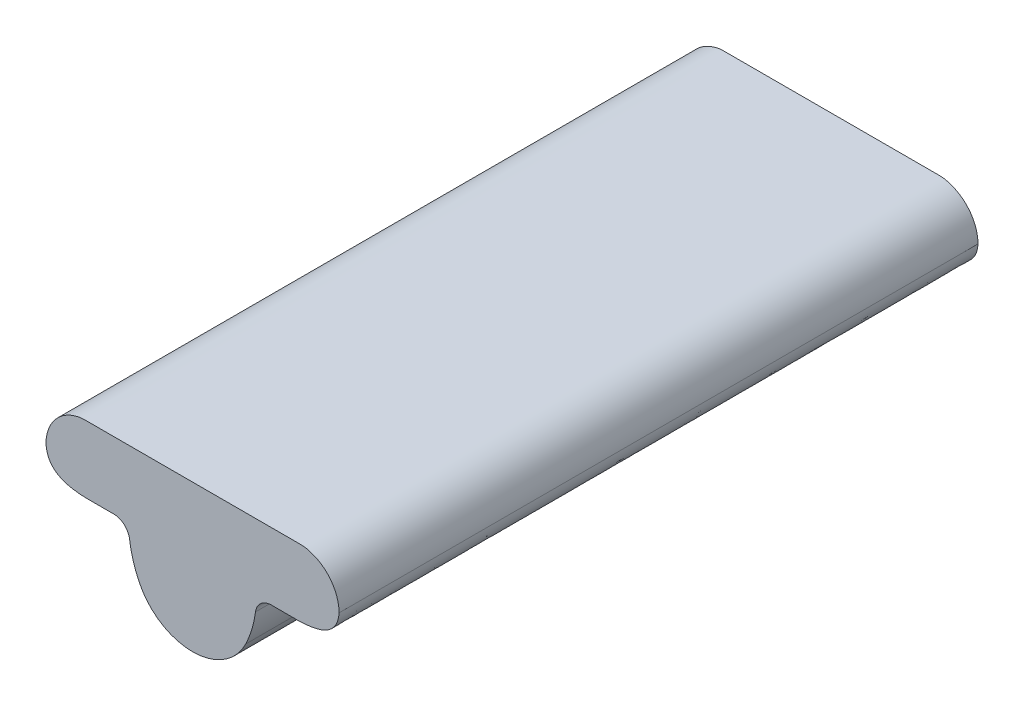
ISO-10303-21;
HEADER;
FILE_DESCRIPTION(('STEP AP214'),'2;1');
FILE_NAME('part.step','',(''),(''),'','','');
FILE_SCHEMA(('AUTOMOTIVE_DESIGN { 1 0 10303 214 1 1 1 1 }'));
ENDSEC;
DATA;
#1=APPLICATION_CONTEXT('core data for automotive mechanical design processes');
#2=APPLICATION_PROTOCOL_DEFINITION('international standard','automotive_design',2000,#1);
#3=PRODUCT_CONTEXT('',#1,'mechanical');
#4=PRODUCT('Part','Part','',(#3));
#5=PRODUCT_RELATED_PRODUCT_CATEGORY('part','',(#4));
#6=PRODUCT_DEFINITION_FORMATION('','',#4);
#7=PRODUCT_DEFINITION_CONTEXT('part definition',#1,'design');
#8=PRODUCT_DEFINITION('design','',#6,#7);
#9=PRODUCT_DEFINITION_SHAPE('','',#8);
#10=(LENGTH_UNIT() NAMED_UNIT(*) SI_UNIT(.MILLI.,.METRE.));
#11=(NAMED_UNIT(*) PLANE_ANGLE_UNIT() SI_UNIT($,.RADIAN.));
#12=(NAMED_UNIT(*) SI_UNIT($,.STERADIAN.) SOLID_ANGLE_UNIT());
#13=UNCERTAINTY_MEASURE_WITH_UNIT(LENGTH_MEASURE(1.E-05),#10,'distance_accuracy_value','');
#14=(GEOMETRIC_REPRESENTATION_CONTEXT(3) GLOBAL_UNCERTAINTY_ASSIGNED_CONTEXT((#13)) GLOBAL_UNIT_ASSIGNED_CONTEXT((#10,
#11,#12)) REPRESENTATION_CONTEXT('',''));
#15=CARTESIAN_POINT('',(0.,0.,0.));
#16=DIRECTION('',(0.,0.,1.));
#17=DIRECTION('',(1.,0.,0.));
#18=AXIS2_PLACEMENT_3D('',#15,#16,#17);
#19=CARTESIAN_POINT('',(-1.376,0.,6.));
#20=CARTESIAN_POINT('',(-1.376,0.156890105253039,6.));
#21=CARTESIAN_POINT('',(-1.2888365276661,0.28733946024189,6.));
#22=CARTESIAN_POINT('',(-1.14388897056927,0.347378704224244,6.));
#23=CARTESIAN_POINT('',(-1.12882892095402,0.353616781024894,6.));
#24=CARTESIAN_POINT('',(-1.09789749611564,0.364134221340183,6.));
#25=CARTESIAN_POINT('',(-1.04890264071871,0.376,6.));
#26=CARTESIAN_POINT('',(-1.01630088023957,0.376,6.));
#27=CARTESIAN_POINT('',(-1.,0.376,6.));
#28=CARTESIAN_POINT('',(-0.983699119760431,0.376,6.));
#29=CARTESIAN_POINT('',(-0.951097359281291,0.376,6.));
#30=CARTESIAN_POINT('',(-0.902194718562581,0.376,6.));
#31=CARTESIAN_POINT('',(-0.869592958083441,0.376,6.));
#32=CARTESIAN_POINT('',(-0.853292077843871,0.376,6.));
#33=CARTESIAN_POINT('',(-0.284430692614624,0.376,6.));
#34=CARTESIAN_POINT('',(0.284430692614624,0.376,6.));
#35=CARTESIAN_POINT('',(0.853292077843872,0.376,6.));
#36=CARTESIAN_POINT('',(0.869592958083442,0.376,6.));
#37=CARTESIAN_POINT('',(0.902194718562581,0.376,6.));
#38=CARTESIAN_POINT('',(0.951097359281291,0.376,6.));
#39=CARTESIAN_POINT('',(0.983699119760431,0.376,6.));
#40=CARTESIAN_POINT('',(1.,0.376,6.));
#41=CARTESIAN_POINT('',(1.01630088023957,0.376,6.));
#42=CARTESIAN_POINT('',(1.04890264071871,0.376,6.));
#43=CARTESIAN_POINT('',(1.09789749611564,0.364134221340183,6.));
#44=CARTESIAN_POINT('',(1.12882892095402,0.353616781024895,6.));
#45=CARTESIAN_POINT('',(1.14388897056927,0.347378704224244,6.));
#46=CARTESIAN_POINT('',(1.2888365276661,0.28733946024189,6.));
#47=CARTESIAN_POINT('',(1.376,0.15689010525304,6.));
#48=CARTESIAN_POINT('',(1.376,0.,6.));
#49=(BOUNDED_CURVE() B_SPLINE_CURVE(3,(#19,#20,#21,#22,#23,#24,#25,#26,#27,#28,#29,#30,#31,#32,
#33,#34,#35,#36,#37,#38,#39,#40,#41,#42,#43,#44,#45,#46,#47,#48),.UNSPECIFIED.,.F.,
.F.) B_SPLINE_CURVE_WITH_KNOTS((4,3,1,1,3,1,1,3,3,1,1,3,1,1,3,4),(0.,0.133521791783524,
0.149150664490664,0.164779537197804,0.180408409904944,0.196037282612083,0.211666155319223,
0.227295028026362,0.772704971973638,0.788333844680778,0.803962717387918,0.819591590095057,
0.835220462802197,0.850849335509337,0.866478208216477,1.),
.UNSPECIFIED.) CURVE() GEOMETRIC_REPRESENTATION_ITEM() RATIONAL_B_SPLINE_CURVE((1.,
0.887646408201697,0.887646408201697,1.,1.,1.,1.,1.,1.,1.,1.,1.,1.,1.,1.,1.,1.,1.,1.,1.,1.,1.,1.,
1.,1.,1.,1.,0.887646408201697,0.887646408201697,1.)) REPRESENTATION_ITEM(''));
#50=DIRECTION('',(0.,0.,-1.));
#51=VECTOR('',#50,1.);
#52=SURFACE_OF_LINEAR_EXTRUSION('',#49,#51);
#53=CARTESIAN_POINT('',(-1.376,0.,0.));
#54=CARTESIAN_POINT('',(-1.376,0.156890105253039,0.));
#55=CARTESIAN_POINT('',(-1.2888365276661,0.28733946024189,0.));
#56=CARTESIAN_POINT('',(-1.14388897056927,0.347378704224244,0.));
#57=CARTESIAN_POINT('',(-1.12882892095402,0.353616781024894,0.));
#58=CARTESIAN_POINT('',(-1.09789749611564,0.364134221340183,0.));
#59=CARTESIAN_POINT('',(-1.04890264071871,0.376,0.));
#60=CARTESIAN_POINT('',(-1.01630088023957,0.376,0.));
#61=CARTESIAN_POINT('',(-1.,0.376,0.));
#62=CARTESIAN_POINT('',(-0.983699119760431,0.376,0.));
#63=CARTESIAN_POINT('',(-0.951097359281291,0.376,0.));
#64=CARTESIAN_POINT('',(-0.902194718562581,0.376,0.));
#65=CARTESIAN_POINT('',(-0.869592958083441,0.376,0.));
#66=CARTESIAN_POINT('',(-0.853292077843871,0.376,0.));
#67=CARTESIAN_POINT('',(-0.284430692614624,0.376,0.));
#68=CARTESIAN_POINT('',(0.284430692614624,0.376,0.));
#69=CARTESIAN_POINT('',(0.853292077843872,0.376,0.));
#70=CARTESIAN_POINT('',(0.869592958083442,0.376,0.));
#71=CARTESIAN_POINT('',(0.902194718562581,0.376,0.));
#72=CARTESIAN_POINT('',(0.951097359281291,0.376,0.));
#73=CARTESIAN_POINT('',(0.983699119760431,0.376,0.));
#74=CARTESIAN_POINT('',(1.,0.376,0.));
#75=CARTESIAN_POINT('',(1.01630088023957,0.376,0.));
#76=CARTESIAN_POINT('',(1.04890264071871,0.376,0.));
#77=CARTESIAN_POINT('',(1.09789749611564,0.364134221340183,0.));
#78=CARTESIAN_POINT('',(1.12882892095402,0.353616781024895,0.));
#79=CARTESIAN_POINT('',(1.14388897056927,0.347378704224244,0.));
#80=CARTESIAN_POINT('',(1.2888365276661,0.28733946024189,0.));
#81=CARTESIAN_POINT('',(1.376,0.15689010525304,0.));
#82=CARTESIAN_POINT('',(1.376,0.,0.));
#83=(BOUNDED_CURVE() B_SPLINE_CURVE(3,(#53,#54,#55,#56,#57,#58,#59,#60,#61,#62,#63,#64,#65,#66,
#67,#68,#69,#70,#71,#72,#73,#74,#75,#76,#77,#78,#79,#80,#81,#82),.UNSPECIFIED.,.F.,
.F.) B_SPLINE_CURVE_WITH_KNOTS((4,3,1,1,3,1,1,3,3,1,1,3,1,1,3,4),(0.,0.133521791783524,
0.149150664490664,0.164779537197804,0.180408409904944,0.196037282612083,0.211666155319223,
0.227295028026362,0.772704971973638,0.788333844680778,0.803962717387918,0.819591590095057,
0.835220462802197,0.850849335509337,0.866478208216477,1.),
.UNSPECIFIED.) CURVE() GEOMETRIC_REPRESENTATION_ITEM() RATIONAL_B_SPLINE_CURVE((1.,
0.887646408201697,0.887646408201697,1.,1.,1.,1.,1.,1.,1.,1.,1.,1.,1.,1.,1.,1.,1.,1.,1.,1.,1.,1.,
1.,1.,1.,1.,0.887646408201697,0.887646408201697,1.)) REPRESENTATION_ITEM(''));
#84=CARTESIAN_POINT('',(-1.376,0.,0.));
#85=VERTEX_POINT('',#84);
#86=CARTESIAN_POINT('',(1.376,0.,0.));
#87=VERTEX_POINT('',#86);
#88=EDGE_CURVE('E148',#85,#87,#83,.T.);
#89=ORIENTED_EDGE('',*,*,#88,.F.);
#90=DIRECTION('',(0.,0.,-1.));
#91=VECTOR('',#90,1.);
#92=CARTESIAN_POINT('',(-1.376,0.,6.));
#93=LINE('',#92,#91);
#94=CARTESIAN_POINT('',(-1.376,0.,6.));
#95=VERTEX_POINT('',#94);
#96=EDGE_CURVE('E11',#95,#85,#93,.T.);
#97=ORIENTED_EDGE('',*,*,#96,.F.);
#98=CARTESIAN_POINT('',(1.376,0.,6.));
#99=VERTEX_POINT('',#98);
#100=EDGE_CURVE('E194',#95,#99,#49,.T.);
#101=ORIENTED_EDGE('',*,*,#100,.T.);
#102=DIRECTION('',(0.,0.,-1.));
#103=VECTOR('',#102,1.);
#104=CARTESIAN_POINT('',(1.376,0.,6.));
#105=LINE('',#104,#103);
#106=EDGE_CURVE('E38',#99,#87,#105,.T.);
#107=ORIENTED_EDGE('',*,*,#106,.T.);
#108=EDGE_LOOP('',(#89,#97,#101,#107));
#109=FACE_BOUND('',#108,.T.);
#110=ADVANCED_FACE('F34',(#109),#52,.T.);
#111=CARTESIAN_POINT('',(-1.376,0.,6.));
#112=CARTESIAN_POINT('',(-1.36230221551758,-0.221622552450132,6.));
#113=CARTESIAN_POINT('',(-1.15141855491426,-0.248602833056371,6.));
#114=CARTESIAN_POINT('',(-1.,-0.254,6.));
#115=B_SPLINE_CURVE_WITH_KNOTS('',3,(#111,#112,#113,#114),.UNSPECIFIED.,.F.,.F.,(4,4),(0.,1.),.UNSPECIFIED.);
#116=DIRECTION('',(0.,0.,-1.));
#117=VECTOR('',#116,1.);
#118=SURFACE_OF_LINEAR_EXTRUSION('',#115,#117);
#119=CARTESIAN_POINT('',(-1.376,0.,0.));
#120=CARTESIAN_POINT('',(-1.36230221551758,-0.221622552450132,0.));
#121=CARTESIAN_POINT('',(-1.15141855491426,-0.248602833056371,0.));
#122=CARTESIAN_POINT('',(-1.,-0.254,0.));
#123=B_SPLINE_CURVE_WITH_KNOTS('',3,(#119,#120,#121,#122),.UNSPECIFIED.,.F.,.F.,(4,4),(0.,1.),.UNSPECIFIED.);
#124=CARTESIAN_POINT('',(-1.,-0.254,0.));
#125=VERTEX_POINT('',#124);
#126=EDGE_CURVE('E86',#85,#125,#123,.T.);
#127=ORIENTED_EDGE('',*,*,#126,.T.);
#128=DIRECTION('',(0.,0.,-1.));
#129=VECTOR('',#128,1.);
#130=CARTESIAN_POINT('',(-1.,-0.254,6.));
#131=LINE('',#130,#129);
#132=CARTESIAN_POINT('',(-1.,-0.254,6.));
#133=VERTEX_POINT('',#132);
#134=EDGE_CURVE('E44',#133,#125,#131,.T.);
#135=ORIENTED_EDGE('',*,*,#134,.F.);
#136=EDGE_CURVE('E123',#95,#133,#115,.T.);
#137=ORIENTED_EDGE('',*,*,#136,.F.);
#138=ORIENTED_EDGE('',*,*,#96,.T.);
#139=EDGE_LOOP('',(#127,#135,#137,#138));
#140=FACE_BOUND('',#139,.T.);
#141=ADVANCED_FACE('F156',(#140),#118,.F.);
#142=CARTESIAN_POINT('',(-1.,-0.254,6.));
#143=DIRECTION('',(0.,1.,0.));
#144=DIRECTION('',(-1.,0.,0.));
#145=AXIS2_PLACEMENT_3D('',#142,#143,#144);
#146=PLANE('',#145);
#147=DIRECTION('',(1.,0.,0.));
#148=VECTOR('',#147,1.);
#149=CARTESIAN_POINT('',(-1.,-0.254,0.));
#150=LINE('',#149,#148);
#151=CARTESIAN_POINT('',(-0.740175425099138,-0.254,0.));
#152=VERTEX_POINT('',#151);
#153=EDGE_CURVE('E130',#125,#152,#150,.T.);
#154=ORIENTED_EDGE('',*,*,#153,.T.);
#155=DIRECTION('',(0.,0.,-1.));
#156=VECTOR('',#155,1.);
#157=CARTESIAN_POINT('',(-0.740175425099138,-0.254,6.));
#158=LINE('',#157,#156);
#159=CARTESIAN_POINT('',(-0.740175425099138,-0.254,6.));
#160=VERTEX_POINT('',#159);
#161=EDGE_CURVE('E127',#160,#152,#158,.T.);
#162=ORIENTED_EDGE('',*,*,#161,.F.);
#163=DIRECTION('',(1.,0.,0.));
#164=VECTOR('',#163,1.);
#165=CARTESIAN_POINT('',(-1.,-0.254,6.));
#166=LINE('',#165,#164);
#167=EDGE_CURVE('E117',#133,#160,#166,.T.);
#168=ORIENTED_EDGE('',*,*,#167,.F.);
#169=ORIENTED_EDGE('',*,*,#134,.T.);
#170=EDGE_LOOP('',(#154,#162,#168,#169));
#171=FACE_BOUND('',#170,.T.);
#172=ADVANCED_FACE('F128',(#171),#146,.F.);
#173=CARTESIAN_POINT('',(-0.740175425099138,-0.404,6.));
#174=DIRECTION('',(0.,0.,-1.));
#175=DIRECTION('',(-1.,0.,0.));
#176=AXIS2_PLACEMENT_3D('',#173,#174,#175);
#177=CYLINDRICAL_SURFACE('',#176,0.15);
#178=CARTESIAN_POINT('',(-0.740175425099138,-0.404,0.));
#179=DIRECTION('',(0.,0.,1.));
#180=DIRECTION('',(1.,0.,0.));
#181=AXIS2_PLACEMENT_3D('',#178,#179,#180);
#182=CIRCLE('',#181,0.15);
#183=CARTESIAN_POINT('',(-0.591456891390555,-0.384434782608696,0.));
#184=VERTEX_POINT('',#183);
#185=EDGE_CURVE('E250',#184,#152,#182,.T.);
#186=ORIENTED_EDGE('',*,*,#185,.F.);
#187=DIRECTION('',(0.,0.,-1.));
#188=VECTOR('',#187,1.);
#189=CARTESIAN_POINT('',(-0.591456891390555,-0.384434782608696,6.));
#190=LINE('',#189,#188);
#191=CARTESIAN_POINT('',(-0.591456891390555,-0.384434782608696,6.));
#192=VERTEX_POINT('',#191);
#193=EDGE_CURVE('E134',#192,#184,#190,.T.);
#194=ORIENTED_EDGE('',*,*,#193,.F.);
#195=CARTESIAN_POINT('',(-0.740175425099138,-0.404,6.));
#196=DIRECTION('',(0.,0.,1.));
#197=DIRECTION('',(1.,0.,0.));
#198=AXIS2_PLACEMENT_3D('',#195,#196,#197);
#199=CIRCLE('',#198,0.15);
#200=EDGE_CURVE('E122',#192,#160,#199,.T.);
#201=ORIENTED_EDGE('',*,*,#200,.T.);
#202=ORIENTED_EDGE('',*,*,#161,.T.);
#203=EDGE_LOOP('',(#186,#194,#201,#202));
#204=FACE_BOUND('',#203,.T.);
#205=ADVANCED_FACE('F136',(#204),#177,.F.);
#206=CARTESIAN_POINT('',(0.4,-0.254,6.));
#207=DIRECTION('',(0.,0.,-1.));
#208=DIRECTION('',(-1.,0.,0.));
#209=AXIS2_PLACEMENT_3D('',#206,#207,#208);
#210=CYLINDRICAL_SURFACE('',#209,1.);
#211=CARTESIAN_POINT('',(0.4,-0.254,0.));
#212=DIRECTION('',(0.,0.,1.));
#213=DIRECTION('',(1.,0.,0.));
#214=AXIS2_PLACEMENT_3D('',#211,#212,#213);
#215=CIRCLE('',#214,1.);
#216=CARTESIAN_POINT('',(-0.498876404494382,-0.692202247191012,0.));
#217=VERTEX_POINT('',#216);
#218=EDGE_CURVE('E248',#184,#217,#215,.T.);
#219=ORIENTED_EDGE('',*,*,#218,.T.);
#220=DIRECTION('',(0.,0.,-1.));
#221=VECTOR('',#220,1.);
#222=CARTESIAN_POINT('',(-0.498876404494382,-0.692202247191012,6.));
#223=LINE('',#222,#221);
#224=CARTESIAN_POINT('',(-0.498876404494382,-0.692202247191012,6.));
#225=VERTEX_POINT('',#224);
#226=EDGE_CURVE('E218',#225,#217,#223,.T.);
#227=ORIENTED_EDGE('',*,*,#226,.F.);
#228=CARTESIAN_POINT('',(0.4,-0.254,6.));
#229=DIRECTION('',(0.,0.,1.));
#230=DIRECTION('',(1.,0.,0.));
#231=AXIS2_PLACEMENT_3D('',#228,#229,#230);
#232=CIRCLE('',#231,1.);
#233=EDGE_CURVE('E138',#192,#225,#232,.T.);
#234=ORIENTED_EDGE('',*,*,#233,.F.);
#235=ORIENTED_EDGE('',*,*,#193,.T.);
#236=EDGE_LOOP('',(#219,#227,#234,#235));
#237=FACE_BOUND('',#236,.T.);
#238=ADVANCED_FACE('F166',(#237),#210,.T.);
#239=CARTESIAN_POINT('',(0.,-0.449,6.));
#240=DIRECTION('',(0.,0.,-1.));
#241=DIRECTION('',(-1.,0.,0.));
#242=AXIS2_PLACEMENT_3D('',#239,#240,#241);
#243=CYLINDRICAL_SURFACE('',#242,0.555);
#244=CARTESIAN_POINT('',(0.,-0.449,0.));
#245=DIRECTION('',(0.,0.,1.));
#246=DIRECTION('',(1.,0.,0.));
#247=AXIS2_PLACEMENT_3D('',#244,#245,#246);
#248=CIRCLE('',#247,0.555);
#249=CARTESIAN_POINT('',(0.498876404494382,-0.692202247191012,0.));
#250=VERTEX_POINT('',#249);
#251=EDGE_CURVE('E215',#217,#250,#248,.T.);
#252=ORIENTED_EDGE('',*,*,#251,.T.);
#253=DIRECTION('',(0.,0.,-1.));
#254=VECTOR('',#253,1.);
#255=CARTESIAN_POINT('',(0.498876404494382,-0.692202247191012,6.));
#256=LINE('',#255,#254);
#257=CARTESIAN_POINT('',(0.498876404494382,-0.692202247191012,6.));
#258=VERTEX_POINT('',#257);
#259=EDGE_CURVE('E213',#258,#250,#256,.T.);
#260=ORIENTED_EDGE('',*,*,#259,.F.);
#261=CARTESIAN_POINT('',(0.,-0.449,6.));
#262=DIRECTION('',(0.,0.,1.));
#263=DIRECTION('',(1.,0.,0.));
#264=AXIS2_PLACEMENT_3D('',#261,#262,#263);
#265=CIRCLE('',#264,0.555);
#266=EDGE_CURVE('E140',#225,#258,#265,.T.);
#267=ORIENTED_EDGE('',*,*,#266,.F.);
#268=ORIENTED_EDGE('',*,*,#226,.T.);
#269=EDGE_LOOP('',(#252,#260,#267,#268));
#270=FACE_BOUND('',#269,.T.);
#271=ADVANCED_FACE('F169',(#270),#243,.T.);
#272=CARTESIAN_POINT('',(-0.4,-0.254,6.));
#273=DIRECTION('',(0.,0.,-1.));
#274=DIRECTION('',(-1.,0.,0.));
#275=AXIS2_PLACEMENT_3D('',#272,#273,#274);
#276=CYLINDRICAL_SURFACE('',#275,1.);
#277=CARTESIAN_POINT('',(-0.4,-0.254,0.));
#278=DIRECTION('',(0.,0.,-1.));
#279=DIRECTION('',(-1.,0.,0.));
#280=AXIS2_PLACEMENT_3D('',#277,#278,#279);
#281=CIRCLE('',#280,1.);
#282=CARTESIAN_POINT('',(0.591456891390555,-0.384434782608696,0.));
#283=VERTEX_POINT('',#282);
#284=EDGE_CURVE('E222',#283,#250,#281,.T.);
#285=ORIENTED_EDGE('',*,*,#284,.F.);
#286=DIRECTION('',(0.,0.,-1.));
#287=VECTOR('',#286,1.);
#288=CARTESIAN_POINT('',(0.591456891390555,-0.384434782608696,6.));
#289=LINE('',#288,#287);
#290=CARTESIAN_POINT('',(0.591456891390555,-0.384434782608696,6.));
#291=VERTEX_POINT('',#290);
#292=EDGE_CURVE('E219',#291,#283,#289,.T.);
#293=ORIENTED_EDGE('',*,*,#292,.F.);
#294=CARTESIAN_POINT('',(-0.4,-0.254,6.));
#295=DIRECTION('',(0.,0.,-1.));
#296=DIRECTION('',(-1.,0.,0.));
#297=AXIS2_PLACEMENT_3D('',#294,#295,#296);
#298=CIRCLE('',#297,1.);
#299=EDGE_CURVE('E205',#291,#258,#298,.T.);
#300=ORIENTED_EDGE('',*,*,#299,.T.);
#301=ORIENTED_EDGE('',*,*,#259,.T.);
#302=EDGE_LOOP('',(#285,#293,#300,#301));
#303=FACE_BOUND('',#302,.T.);
#304=ADVANCED_FACE('F173',(#303),#276,.T.);
#305=CARTESIAN_POINT('',(0.740175425099138,-0.404,6.));
#306=DIRECTION('',(0.,0.,-1.));
#307=DIRECTION('',(-1.,0.,0.));
#308=AXIS2_PLACEMENT_3D('',#305,#306,#307);
#309=CYLINDRICAL_SURFACE('',#308,0.15);
#310=CARTESIAN_POINT('',(0.740175425099138,-0.404,0.));
#311=DIRECTION('',(0.,0.,-1.));
#312=DIRECTION('',(-1.,0.,0.));
#313=AXIS2_PLACEMENT_3D('',#310,#311,#312);
#314=CIRCLE('',#313,0.15);
#315=CARTESIAN_POINT('',(0.740175425099138,-0.254,0.));
#316=VERTEX_POINT('',#315);
#317=EDGE_CURVE('E237',#283,#316,#314,.T.);
#318=ORIENTED_EDGE('',*,*,#317,.T.);
#319=DIRECTION('',(0.,0.,-1.));
#320=VECTOR('',#319,1.);
#321=CARTESIAN_POINT('',(0.740175425099138,-0.254,6.));
#322=LINE('',#321,#320);
#323=CARTESIAN_POINT('',(0.740175425099138,-0.254,6.));
#324=VERTEX_POINT('',#323);
#325=EDGE_CURVE('E225',#324,#316,#322,.T.);
#326=ORIENTED_EDGE('',*,*,#325,.F.);
#327=CARTESIAN_POINT('',(0.740175425099138,-0.404,6.));
#328=DIRECTION('',(0.,0.,-1.));
#329=DIRECTION('',(-1.,0.,0.));
#330=AXIS2_PLACEMENT_3D('',#327,#328,#329);
#331=CIRCLE('',#330,0.15);
#332=EDGE_CURVE('E203',#291,#324,#331,.T.);
#333=ORIENTED_EDGE('',*,*,#332,.F.);
#334=ORIENTED_EDGE('',*,*,#292,.T.);
#335=EDGE_LOOP('',(#318,#326,#333,#334));
#336=FACE_BOUND('',#335,.T.);
#337=ADVANCED_FACE('F177',(#336),#309,.F.);
#338=CARTESIAN_POINT('',(1.,-0.254,6.));
#339=DIRECTION('',(0.,-1.,0.));
#340=DIRECTION('',(1.,0.,0.));
#341=AXIS2_PLACEMENT_3D('',#338,#339,#340);
#342=PLANE('',#341);
#343=DIRECTION('',(-1.,0.,0.));
#344=VECTOR('',#343,1.);
#345=CARTESIAN_POINT('',(1.,-0.254,0.));
#346=LINE('',#345,#344);
#347=CARTESIAN_POINT('',(1.,-0.254,0.));
#348=VERTEX_POINT('',#347);
#349=EDGE_CURVE('E235',#348,#316,#346,.T.);
#350=ORIENTED_EDGE('',*,*,#349,.F.);
#351=DIRECTION('',(0.,0.,-1.));
#352=VECTOR('',#351,1.);
#353=CARTESIAN_POINT('',(1.,-0.254,6.));
#354=LINE('',#353,#352);
#355=CARTESIAN_POINT('',(1.,-0.254,6.));
#356=VERTEX_POINT('',#355);
#357=EDGE_CURVE('E229',#356,#348,#354,.T.);
#358=ORIENTED_EDGE('',*,*,#357,.F.);
#359=DIRECTION('',(-1.,0.,0.));
#360=VECTOR('',#359,1.);
#361=CARTESIAN_POINT('',(1.,-0.254,6.));
#362=LINE('',#361,#360);
#363=EDGE_CURVE('E193',#356,#324,#362,.T.);
#364=ORIENTED_EDGE('',*,*,#363,.T.);
#365=ORIENTED_EDGE('',*,*,#325,.T.);
#366=EDGE_LOOP('',(#350,#358,#364,#365));
#367=FACE_BOUND('',#366,.T.);
#368=ADVANCED_FACE('F181',(#367),#342,.T.);
#369=CARTESIAN_POINT('',(1.376,0.,6.));
#370=CARTESIAN_POINT('',(1.36230221551758,-0.221622552450132,6.));
#371=CARTESIAN_POINT('',(1.15141855491426,-0.248602833056371,6.));
#372=CARTESIAN_POINT('',(1.,-0.254,6.));
#373=B_SPLINE_CURVE_WITH_KNOTS('',3,(#369,#370,#371,#372),.UNSPECIFIED.,.F.,.F.,(4,4),(0.,1.),.UNSPECIFIED.);
#374=DIRECTION('',(0.,0.,-1.));
#375=VECTOR('',#374,1.);
#376=SURFACE_OF_LINEAR_EXTRUSION('',#373,#375);
#377=CARTESIAN_POINT('',(1.376,0.,0.));
#378=CARTESIAN_POINT('',(1.36230221551758,-0.221622552450132,0.));
#379=CARTESIAN_POINT('',(1.15141855491426,-0.248602833056371,0.));
#380=CARTESIAN_POINT('',(1.,-0.254,0.));
#381=B_SPLINE_CURVE_WITH_KNOTS('',3,(#377,#378,#379,#380),.UNSPECIFIED.,.F.,.F.,(4,4),(0.,1.),.UNSPECIFIED.);
#382=EDGE_CURVE('E232',#87,#348,#381,.T.);
#383=ORIENTED_EDGE('',*,*,#382,.F.);
#384=ORIENTED_EDGE('',*,*,#106,.F.);
#385=EDGE_CURVE('E188',#99,#356,#373,.T.);
#386=ORIENTED_EDGE('',*,*,#385,.T.);
#387=ORIENTED_EDGE('',*,*,#357,.T.);
#388=EDGE_LOOP('',(#383,#384,#386,#387));
#389=FACE_BOUND('',#388,.T.);
#390=ADVANCED_FACE('F184',(#389),#376,.T.);
#391=CARTESIAN_POINT('',(0.,0.376,6.));
#392=DIRECTION('',(0.,0.,1.));
#393=DIRECTION('',(1.,0.,0.));
#394=AXIS2_PLACEMENT_3D('',#391,#392,#393);
#395=PLANE('',#394);
#396=ORIENTED_EDGE('',*,*,#100,.F.);
#397=ORIENTED_EDGE('',*,*,#136,.T.);
#398=ORIENTED_EDGE('',*,*,#167,.T.);
#399=ORIENTED_EDGE('',*,*,#200,.F.);
#400=ORIENTED_EDGE('',*,*,#233,.T.);
#401=ORIENTED_EDGE('',*,*,#266,.T.);
#402=ORIENTED_EDGE('',*,*,#299,.F.);
#403=ORIENTED_EDGE('',*,*,#332,.T.);
#404=ORIENTED_EDGE('',*,*,#363,.F.);
#405=ORIENTED_EDGE('',*,*,#385,.F.);
#406=EDGE_LOOP('',(#396,#397,#398,#399,#400,#401,#402,#403,#404,#405));
#407=FACE_BOUND('',#406,.T.);
#408=ADVANCED_FACE('F120',(#407),#395,.T.);
#409=CARTESIAN_POINT('',(0.,0.376,0.));
#410=DIRECTION('',(0.,0.,1.));
#411=DIRECTION('',(1.,0.,0.));
#412=AXIS2_PLACEMENT_3D('',#409,#410,#411);
#413=PLANE('',#412);
#414=ORIENTED_EDGE('',*,*,#88,.T.);
#415=ORIENTED_EDGE('',*,*,#382,.T.);
#416=ORIENTED_EDGE('',*,*,#349,.T.);
#417=ORIENTED_EDGE('',*,*,#317,.F.);
#418=ORIENTED_EDGE('',*,*,#284,.T.);
#419=ORIENTED_EDGE('',*,*,#251,.F.);
#420=ORIENTED_EDGE('',*,*,#218,.F.);
#421=ORIENTED_EDGE('',*,*,#185,.T.);
#422=ORIENTED_EDGE('',*,*,#153,.F.);
#423=ORIENTED_EDGE('',*,*,#126,.F.);
#424=EDGE_LOOP('',(#414,#415,#416,#417,#418,#419,#420,#421,#422,#423));
#425=FACE_BOUND('',#424,.T.);
#426=ADVANCED_FACE('F160',(#425),#413,.F.);
#427=CLOSED_SHELL('',(#110,#141,#172,#205,#238,#271,#304,#337,#368,#390,#408,#426));
#428=MANIFOLD_SOLID_BREP('B2',#427);
#429=ADVANCED_BREP_SHAPE_REPRESENTATION('',(#18,#428),#14);
#430=SHAPE_DEFINITION_REPRESENTATION(#9,#429);
ENDSEC;
END-ISO-10303-21;
